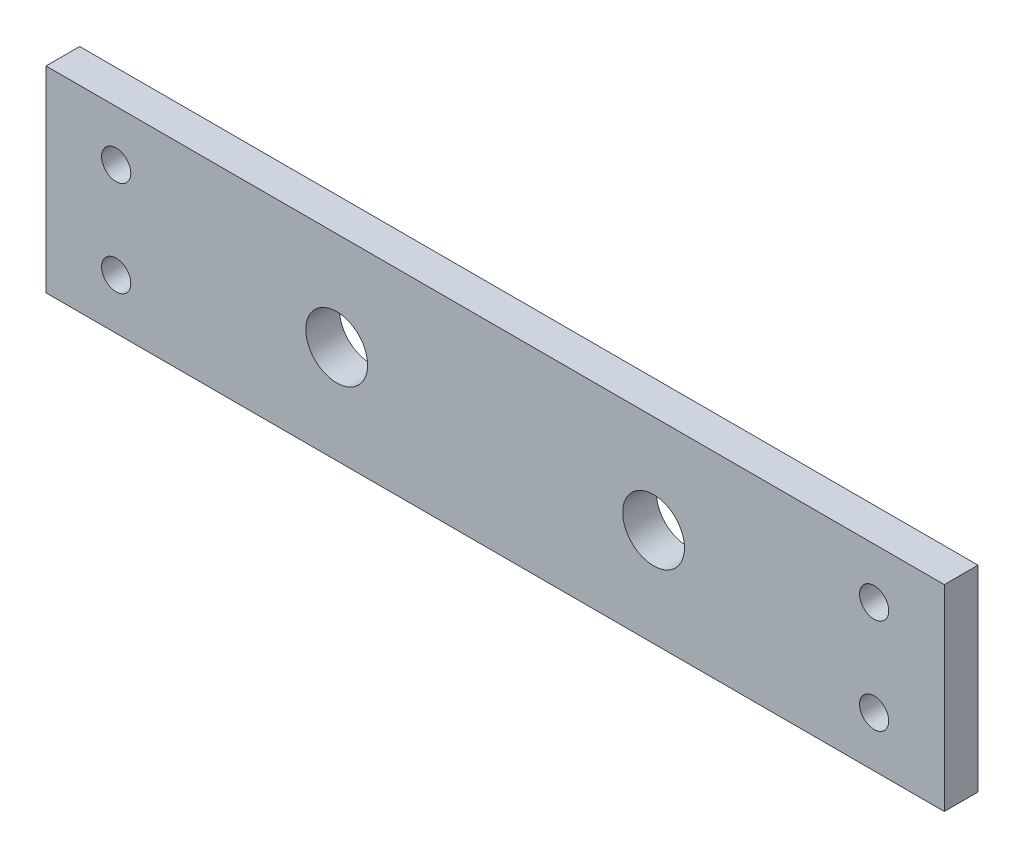
ISO-10303-21;
HEADER;
FILE_DESCRIPTION(('STEP AP214'),'2;1');
FILE_NAME('part.step','',(''),(''),'','','');
FILE_SCHEMA(('AUTOMOTIVE_DESIGN { 1 0 10303 214 1 1 1 1 }'));
ENDSEC;
DATA;
#1=APPLICATION_CONTEXT('core data for automotive mechanical design processes');
#2=APPLICATION_PROTOCOL_DEFINITION('international standard','automotive_design',2000,#1);
#3=PRODUCT_CONTEXT('',#1,'mechanical');
#4=PRODUCT('Part','Part','',(#3));
#5=PRODUCT_RELATED_PRODUCT_CATEGORY('part','',(#4));
#6=PRODUCT_DEFINITION_FORMATION('','',#4);
#7=PRODUCT_DEFINITION_CONTEXT('part definition',#1,'design');
#8=PRODUCT_DEFINITION('design','',#6,#7);
#9=PRODUCT_DEFINITION_SHAPE('','',#8);
#10=(LENGTH_UNIT() NAMED_UNIT(*) SI_UNIT(.MILLI.,.METRE.));
#11=(NAMED_UNIT(*) PLANE_ANGLE_UNIT() SI_UNIT($,.RADIAN.));
#12=(NAMED_UNIT(*) SI_UNIT($,.STERADIAN.) SOLID_ANGLE_UNIT());
#13=UNCERTAINTY_MEASURE_WITH_UNIT(LENGTH_MEASURE(1.E-05),#10,'distance_accuracy_value','');
#14=(GEOMETRIC_REPRESENTATION_CONTEXT(3) GLOBAL_UNCERTAINTY_ASSIGNED_CONTEXT((#13)) GLOBAL_UNIT_ASSIGNED_CONTEXT((#10,
#11,#12)) REPRESENTATION_CONTEXT('',''));
#15=CARTESIAN_POINT('',(0.,0.,0.));
#16=DIRECTION('',(0.,0.,1.));
#17=DIRECTION('',(1.,0.,0.));
#18=AXIS2_PLACEMENT_3D('',#15,#16,#17);
#19=CARTESIAN_POINT('',(80.,17.5,6.));
#20=DIRECTION('',(-1.,0.,0.));
#21=DIRECTION('',(0.,0.,1.));
#22=AXIS2_PLACEMENT_3D('',#19,#20,#21);
#23=PLANE('',#22);
#24=DIRECTION('',(0.,1.,0.));
#25=VECTOR('',#24,1.);
#26=CARTESIAN_POINT('',(80.,17.5,0.));
#27=LINE('',#26,#25);
#28=CARTESIAN_POINT('',(80.,-17.5,0.));
#29=VERTEX_POINT('',#28);
#30=CARTESIAN_POINT('',(80.,17.5,0.));
#31=VERTEX_POINT('',#30);
#32=EDGE_CURVE('E98',#29,#31,#27,.T.);
#33=ORIENTED_EDGE('',*,*,#32,.T.);
#34=DIRECTION('',(0.,0.,-1.));
#35=VECTOR('',#34,1.);
#36=CARTESIAN_POINT('',(80.,17.5,6.));
#37=LINE('',#36,#35);
#38=CARTESIAN_POINT('',(80.,17.5,6.));
#39=VERTEX_POINT('',#38);
#40=EDGE_CURVE('E11',#39,#31,#37,.T.);
#41=ORIENTED_EDGE('',*,*,#40,.F.);
#42=DIRECTION('',(0.,1.,0.));
#43=VECTOR('',#42,1.);
#44=CARTESIAN_POINT('',(80.,17.5,6.));
#45=LINE('',#44,#43);
#46=CARTESIAN_POINT('',(80.,-17.5,6.));
#47=VERTEX_POINT('',#46);
#48=EDGE_CURVE('E86',#47,#39,#45,.T.);
#49=ORIENTED_EDGE('',*,*,#48,.F.);
#50=DIRECTION('',(0.,0.,-1.));
#51=VECTOR('',#50,1.);
#52=CARTESIAN_POINT('',(80.,-17.5,6.));
#53=LINE('',#52,#51);
#54=EDGE_CURVE('E94',#47,#29,#53,.T.);
#55=ORIENTED_EDGE('',*,*,#54,.T.);
#56=EDGE_LOOP('',(#33,#41,#49,#55));
#57=FACE_BOUND('',#56,.T.);
#58=ADVANCED_FACE('F35',(#57),#23,.F.);
#59=CARTESIAN_POINT('',(-80.,17.5,6.));
#60=DIRECTION('',(0.,-1.,0.));
#61=DIRECTION('',(0.,0.,-1.));
#62=AXIS2_PLACEMENT_3D('',#59,#60,#61);
#63=PLANE('',#62);
#64=DIRECTION('',(-1.,0.,0.));
#65=VECTOR('',#64,1.);
#66=CARTESIAN_POINT('',(-80.,17.5,0.));
#67=LINE('',#66,#65);
#68=CARTESIAN_POINT('',(-80.,17.5,0.));
#69=VERTEX_POINT('',#68);
#70=EDGE_CURVE('E90',#31,#69,#67,.T.);
#71=ORIENTED_EDGE('',*,*,#70,.T.);
#72=DIRECTION('',(0.,0.,-1.));
#73=VECTOR('',#72,1.);
#74=CARTESIAN_POINT('',(-80.,17.5,6.));
#75=LINE('',#74,#73);
#76=CARTESIAN_POINT('',(-80.,17.5,6.));
#77=VERTEX_POINT('',#76);
#78=EDGE_CURVE('E43',#77,#69,#75,.T.);
#79=ORIENTED_EDGE('',*,*,#78,.F.);
#80=DIRECTION('',(-1.,0.,0.));
#81=VECTOR('',#80,1.);
#82=CARTESIAN_POINT('',(-80.,17.5,6.));
#83=LINE('',#82,#81);
#84=EDGE_CURVE('E81',#39,#77,#83,.T.);
#85=ORIENTED_EDGE('',*,*,#84,.F.);
#86=ORIENTED_EDGE('',*,*,#40,.T.);
#87=EDGE_LOOP('',(#71,#79,#85,#86));
#88=FACE_BOUND('',#87,.T.);
#89=ADVANCED_FACE('F89',(#88),#63,.F.);
#90=CARTESIAN_POINT('',(-80.,17.5,6.));
#91=DIRECTION('',(1.,0.,0.));
#92=DIRECTION('',(0.,0.,-1.));
#93=AXIS2_PLACEMENT_3D('',#90,#91,#92);
#94=PLANE('',#93);
#95=DIRECTION('',(0.,-1.,0.));
#96=VECTOR('',#95,1.);
#97=CARTESIAN_POINT('',(-80.,17.5,0.));
#98=LINE('',#97,#96);
#99=CARTESIAN_POINT('',(-80.,-17.5,0.));
#100=VERTEX_POINT('',#99);
#101=EDGE_CURVE('E68',#69,#100,#98,.T.);
#102=ORIENTED_EDGE('',*,*,#101,.T.);
#103=DIRECTION('',(0.,0.,-1.));
#104=VECTOR('',#103,1.);
#105=CARTESIAN_POINT('',(-80.,-17.5,6.));
#106=LINE('',#105,#104);
#107=CARTESIAN_POINT('',(-80.,-17.5,6.));
#108=VERTEX_POINT('',#107);
#109=EDGE_CURVE('E91',#108,#100,#106,.T.);
#110=ORIENTED_EDGE('',*,*,#109,.F.);
#111=DIRECTION('',(0.,-1.,0.));
#112=VECTOR('',#111,1.);
#113=CARTESIAN_POINT('',(-80.,17.5,6.));
#114=LINE('',#113,#112);
#115=EDGE_CURVE('E84',#77,#108,#114,.T.);
#116=ORIENTED_EDGE('',*,*,#115,.F.);
#117=ORIENTED_EDGE('',*,*,#78,.T.);
#118=EDGE_LOOP('',(#102,#110,#116,#117));
#119=FACE_BOUND('',#118,.T.);
#120=ADVANCED_FACE('F92',(#119),#94,.F.);
#121=CARTESIAN_POINT('',(-80.,-17.5,6.));
#122=DIRECTION('',(0.,1.,0.));
#123=DIRECTION('',(0.,0.,1.));
#124=AXIS2_PLACEMENT_3D('',#121,#122,#123);
#125=PLANE('',#124);
#126=DIRECTION('',(1.,0.,0.));
#127=VECTOR('',#126,1.);
#128=CARTESIAN_POINT('',(-80.,-17.5,0.));
#129=LINE('',#128,#127);
#130=EDGE_CURVE('E74',#100,#29,#129,.T.);
#131=ORIENTED_EDGE('',*,*,#130,.T.);
#132=ORIENTED_EDGE('',*,*,#54,.F.);
#133=DIRECTION('',(1.,0.,0.));
#134=VECTOR('',#133,1.);
#135=CARTESIAN_POINT('',(-80.,-17.5,6.));
#136=LINE('',#135,#134);
#137=EDGE_CURVE('E51',#108,#47,#136,.T.);
#138=ORIENTED_EDGE('',*,*,#137,.F.);
#139=ORIENTED_EDGE('',*,*,#109,.T.);
#140=EDGE_LOOP('',(#131,#132,#138,#139));
#141=FACE_BOUND('',#140,.T.);
#142=ADVANCED_FACE('F106',(#141),#125,.F.);
#143=CARTESIAN_POINT('',(0.,0.,6.));
#144=DIRECTION('',(0.,0.,1.));
#145=DIRECTION('',(1.,0.,0.));
#146=AXIS2_PLACEMENT_3D('',#143,#144,#145);
#147=PLANE('',#146);
#148=CARTESIAN_POINT('',(28.22,0.,6.));
#149=DIRECTION('',(0.,0.,1.));
#150=DIRECTION('',(1.,0.,0.));
#151=AXIS2_PLACEMENT_3D('',#148,#149,#150);
#152=CIRCLE('',#151,5.5);
#153=CARTESIAN_POINT('',(33.72,0.,6.));
#154=VERTEX_POINT('',#153);
#155=EDGE_CURVE('E139',#154,#154,#152,.T.);
#156=ORIENTED_EDGE('',*,*,#155,.F.);
#157=EDGE_LOOP('',(#156));
#158=FACE_BOUND('',#157,.T.);
#159=CARTESIAN_POINT('',(-28.22,0.,6.));
#160=DIRECTION('',(0.,0.,1.));
#161=DIRECTION('',(-1.,0.,0.));
#162=AXIS2_PLACEMENT_3D('',#159,#160,#161);
#163=CIRCLE('',#162,5.5);
#164=CARTESIAN_POINT('',(-22.72,0.,6.));
#165=VERTEX_POINT('',#164);
#166=EDGE_CURVE('E140',#165,#165,#163,.T.);
#167=ORIENTED_EDGE('',*,*,#166,.F.);
#168=EDGE_LOOP('',(#167));
#169=FACE_BOUND('',#168,.T.);
#170=CARTESIAN_POINT('',(67.5,-8.5,6.));
#171=DIRECTION('',(0.,0.,1.));
#172=DIRECTION('',(1.,0.,0.));
#173=AXIS2_PLACEMENT_3D('',#170,#171,#172);
#174=CIRCLE('',#173,2.6);
#175=CARTESIAN_POINT('',(70.1,-8.5,6.));
#176=VERTEX_POINT('',#175);
#177=EDGE_CURVE('E121',#176,#176,#174,.T.);
#178=ORIENTED_EDGE('',*,*,#177,.F.);
#179=EDGE_LOOP('',(#178));
#180=FACE_BOUND('',#179,.T.);
#181=CARTESIAN_POINT('',(-67.5,8.5,6.));
#182=DIRECTION('',(0.,0.,1.));
#183=DIRECTION('',(1.,0.,0.));
#184=AXIS2_PLACEMENT_3D('',#181,#182,#183);
#185=CIRCLE('',#184,2.6);
#186=CARTESIAN_POINT('',(-64.9,8.5,6.));
#187=VERTEX_POINT('',#186);
#188=EDGE_CURVE('E122',#187,#187,#185,.T.);
#189=ORIENTED_EDGE('',*,*,#188,.F.);
#190=EDGE_LOOP('',(#189));
#191=FACE_BOUND('',#190,.T.);
#192=CARTESIAN_POINT('',(-67.5,-8.5,6.));
#193=DIRECTION('',(0.,0.,1.));
#194=DIRECTION('',(1.,0.,0.));
#195=AXIS2_PLACEMENT_3D('',#192,#193,#194);
#196=CIRCLE('',#195,2.6);
#197=CARTESIAN_POINT('',(-64.9,-8.5,6.));
#198=VERTEX_POINT('',#197);
#199=EDGE_CURVE('E132',#198,#198,#196,.T.);
#200=ORIENTED_EDGE('',*,*,#199,.F.);
#201=EDGE_LOOP('',(#200));
#202=FACE_BOUND('',#201,.T.);
#203=CARTESIAN_POINT('',(67.5,8.5,6.));
#204=DIRECTION('',(0.,0.,1.));
#205=DIRECTION('',(1.,0.,0.));
#206=AXIS2_PLACEMENT_3D('',#203,#204,#205);
#207=CIRCLE('',#206,2.6);
#208=CARTESIAN_POINT('',(70.1,8.5,6.));
#209=VERTEX_POINT('',#208);
#210=EDGE_CURVE('E114',#209,#209,#207,.T.);
#211=ORIENTED_EDGE('',*,*,#210,.F.);
#212=EDGE_LOOP('',(#211));
#213=FACE_BOUND('',#212,.T.);
#214=ORIENTED_EDGE('',*,*,#48,.T.);
#215=ORIENTED_EDGE('',*,*,#84,.T.);
#216=ORIENTED_EDGE('',*,*,#115,.T.);
#217=ORIENTED_EDGE('',*,*,#137,.T.);
#218=EDGE_LOOP('',(#214,#215,#216,#217));
#219=FACE_BOUND('',#218,.T.);
#220=ADVANCED_FACE('F82',(#158,#169,#180,#191,#202,#213,#219),#147,.T.);
#221=CARTESIAN_POINT('',(0.,0.,0.));
#222=DIRECTION('',(0.,0.,1.));
#223=DIRECTION('',(1.,0.,0.));
#224=AXIS2_PLACEMENT_3D('',#221,#222,#223);
#225=PLANE('',#224);
#226=CARTESIAN_POINT('',(28.22,0.,0.));
#227=DIRECTION('',(0.,0.,1.));
#228=DIRECTION('',(1.,0.,0.));
#229=AXIS2_PLACEMENT_3D('',#226,#227,#228);
#230=CIRCLE('',#229,5.5);
#231=CARTESIAN_POINT('',(33.72,0.,0.));
#232=VERTEX_POINT('',#231);
#233=EDGE_CURVE('E135',#232,#232,#230,.F.);
#234=ORIENTED_EDGE('',*,*,#233,.F.);
#235=EDGE_LOOP('',(#234));
#236=FACE_BOUND('',#235,.T.);
#237=CARTESIAN_POINT('',(-28.22,0.,0.));
#238=DIRECTION('',(0.,0.,1.));
#239=DIRECTION('',(1.,0.,0.));
#240=AXIS2_PLACEMENT_3D('',#237,#238,#239);
#241=CIRCLE('',#240,5.5);
#242=CARTESIAN_POINT('',(-22.72,0.,0.));
#243=VERTEX_POINT('',#242);
#244=EDGE_CURVE('E136',#243,#243,#241,.F.);
#245=ORIENTED_EDGE('',*,*,#244,.F.);
#246=EDGE_LOOP('',(#245));
#247=FACE_BOUND('',#246,.T.);
#248=CARTESIAN_POINT('',(67.5,-8.5,0.));
#249=DIRECTION('',(0.,0.,1.));
#250=DIRECTION('',(1.,0.,0.));
#251=AXIS2_PLACEMENT_3D('',#248,#249,#250);
#252=CIRCLE('',#251,2.6);
#253=CARTESIAN_POINT('',(70.1,-8.5,0.));
#254=VERTEX_POINT('',#253);
#255=EDGE_CURVE('E117',#254,#254,#252,.F.);
#256=ORIENTED_EDGE('',*,*,#255,.F.);
#257=EDGE_LOOP('',(#256));
#258=FACE_BOUND('',#257,.T.);
#259=CARTESIAN_POINT('',(-67.5,8.5,0.));
#260=DIRECTION('',(0.,0.,1.));
#261=DIRECTION('',(1.,0.,0.));
#262=AXIS2_PLACEMENT_3D('',#259,#260,#261);
#263=CIRCLE('',#262,2.6);
#264=CARTESIAN_POINT('',(-64.9,8.5,0.));
#265=VERTEX_POINT('',#264);
#266=EDGE_CURVE('E118',#265,#265,#263,.F.);
#267=ORIENTED_EDGE('',*,*,#266,.F.);
#268=EDGE_LOOP('',(#267));
#269=FACE_BOUND('',#268,.T.);
#270=CARTESIAN_POINT('',(-67.5,-8.5,0.));
#271=DIRECTION('',(0.,0.,1.));
#272=DIRECTION('',(1.,0.,0.));
#273=AXIS2_PLACEMENT_3D('',#270,#271,#272);
#274=CIRCLE('',#273,2.6);
#275=CARTESIAN_POINT('',(-64.9,-8.5,0.));
#276=VERTEX_POINT('',#275);
#277=EDGE_CURVE('E125',#276,#276,#274,.F.);
#278=ORIENTED_EDGE('',*,*,#277,.F.);
#279=EDGE_LOOP('',(#278));
#280=FACE_BOUND('',#279,.T.);
#281=CARTESIAN_POINT('',(67.5,8.5,0.));
#282=DIRECTION('',(0.,0.,1.));
#283=DIRECTION('',(1.,0.,0.));
#284=AXIS2_PLACEMENT_3D('',#281,#282,#283);
#285=CIRCLE('',#284,2.6);
#286=CARTESIAN_POINT('',(70.1,8.5,0.));
#287=VERTEX_POINT('',#286);
#288=EDGE_CURVE('E101',#287,#287,#285,.F.);
#289=ORIENTED_EDGE('',*,*,#288,.F.);
#290=EDGE_LOOP('',(#289));
#291=FACE_BOUND('',#290,.T.);
#292=ORIENTED_EDGE('',*,*,#32,.F.);
#293=ORIENTED_EDGE('',*,*,#130,.F.);
#294=ORIENTED_EDGE('',*,*,#101,.F.);
#295=ORIENTED_EDGE('',*,*,#70,.F.);
#296=EDGE_LOOP('',(#292,#293,#294,#295));
#297=FACE_BOUND('',#296,.T.);
#298=ADVANCED_FACE('F109',(#236,#247,#258,#269,#280,#291,#297),#225,.F.);
#299=CARTESIAN_POINT('',(67.5,8.5,-0.00100000000000013));
#300=DIRECTION('',(0.,0.,1.));
#301=DIRECTION('',(1.,0.,0.));
#302=AXIS2_PLACEMENT_3D('',#299,#300,#301);
#303=CYLINDRICAL_SURFACE('',#302,2.6);
#304=CARTESIAN_POINT('',(70.1,8.5,6.));
#305=CARTESIAN_POINT('',(70.1,8.5,5.9375));
#306=CARTESIAN_POINT('',(70.1,8.5,5.875));
#307=CARTESIAN_POINT('',(70.1,8.5,5.75));
#308=CARTESIAN_POINT('',(70.1,8.5,5.6875));
#309=CARTESIAN_POINT('',(70.1,8.5,5.5625));
#310=CARTESIAN_POINT('',(70.1,8.5,5.5));
#311=CARTESIAN_POINT('',(70.1,8.5,5.375));
#312=CARTESIAN_POINT('',(70.1,8.5,5.3125));
#313=CARTESIAN_POINT('',(70.1,8.5,5.1875));
#314=CARTESIAN_POINT('',(70.1,8.5,5.125));
#315=CARTESIAN_POINT('',(70.1,8.5,5.));
#316=CARTESIAN_POINT('',(70.1,8.5,4.9375));
#317=CARTESIAN_POINT('',(70.1,8.5,4.8125));
#318=CARTESIAN_POINT('',(70.1,8.5,4.75));
#319=CARTESIAN_POINT('',(70.1,8.5,4.625));
#320=CARTESIAN_POINT('',(70.1,8.5,4.5625));
#321=CARTESIAN_POINT('',(70.1,8.5,4.4375));
#322=CARTESIAN_POINT('',(70.1,8.5,4.375));
#323=CARTESIAN_POINT('',(70.1,8.5,4.25));
#324=CARTESIAN_POINT('',(70.1,8.5,4.1875));
#325=CARTESIAN_POINT('',(70.1,8.5,4.0625));
#326=CARTESIAN_POINT('',(70.1,8.5,4.));
#327=CARTESIAN_POINT('',(70.1,8.5,3.875));
#328=CARTESIAN_POINT('',(70.1,8.5,3.8125));
#329=CARTESIAN_POINT('',(70.1,8.5,3.6875));
#330=CARTESIAN_POINT('',(70.1,8.5,3.625));
#331=CARTESIAN_POINT('',(70.1,8.5,3.5));
#332=CARTESIAN_POINT('',(70.1,8.5,3.4375));
#333=CARTESIAN_POINT('',(70.1,8.5,3.3125));
#334=CARTESIAN_POINT('',(70.1,8.5,3.25));
#335=CARTESIAN_POINT('',(70.1,8.5,3.125));
#336=CARTESIAN_POINT('',(70.1,8.5,3.0625));
#337=CARTESIAN_POINT('',(70.1,8.5,2.9375));
#338=CARTESIAN_POINT('',(70.1,8.5,2.875));
#339=CARTESIAN_POINT('',(70.1,8.5,2.75));
#340=CARTESIAN_POINT('',(70.1,8.5,2.6875));
#341=CARTESIAN_POINT('',(70.1,8.5,2.5625));
#342=CARTESIAN_POINT('',(70.1,8.5,2.5));
#343=CARTESIAN_POINT('',(70.1,8.5,2.375));
#344=CARTESIAN_POINT('',(70.1,8.5,2.3125));
#345=CARTESIAN_POINT('',(70.1,8.5,2.1875));
#346=CARTESIAN_POINT('',(70.1,8.5,2.125));
#347=CARTESIAN_POINT('',(70.1,8.5,2.));
#348=CARTESIAN_POINT('',(70.1,8.5,1.9375));
#349=CARTESIAN_POINT('',(70.1,8.5,1.8125));
#350=CARTESIAN_POINT('',(70.1,8.5,1.75));
#351=CARTESIAN_POINT('',(70.1,8.5,1.625));
#352=CARTESIAN_POINT('',(70.1,8.5,1.5625));
#353=CARTESIAN_POINT('',(70.1,8.5,1.4375));
#354=CARTESIAN_POINT('',(70.1,8.5,1.375));
#355=CARTESIAN_POINT('',(70.1,8.5,1.25));
#356=CARTESIAN_POINT('',(70.1,8.5,1.1875));
#357=CARTESIAN_POINT('',(70.1,8.5,1.0625));
#358=CARTESIAN_POINT('',(70.1,8.5,1.));
#359=CARTESIAN_POINT('',(70.1,8.5,0.875));
#360=CARTESIAN_POINT('',(70.1,8.5,0.8125));
#361=CARTESIAN_POINT('',(70.1,8.5,0.6875));
#362=CARTESIAN_POINT('',(70.1,8.5,0.625));
#363=CARTESIAN_POINT('',(70.1,8.5,0.5));
#364=CARTESIAN_POINT('',(70.1,8.5,0.4375));
#365=CARTESIAN_POINT('',(70.1,8.5,0.3125));
#366=CARTESIAN_POINT('',(70.1,8.5,0.25));
#367=CARTESIAN_POINT('',(70.1,8.5,0.125));
#368=CARTESIAN_POINT('',(70.1,8.5,0.0625000000000001));
#369=CARTESIAN_POINT('',(70.1,8.5,0.));
#370=B_SPLINE_CURVE_WITH_KNOTS('',3,(#304,#305,#306,#307,#308,#309,#310,#311,#312,#313,#314,
#315,#316,#317,#318,#319,#320,#321,#322,#323,#324,#325,#326,#327,#328,#329,#330,#331,#332,#333,
#334,#335,#336,#337,#338,#339,#340,#341,#342,#343,#344,#345,#346,#347,#348,#349,#350,#351,#352,
#353,#354,#355,#356,#357,#358,#359,#360,#361,#362,#363,#364,#365,#366,#367,#368,#369),
.UNSPECIFIED.,.F.,.F.,(4,2,2,2,2,2,2,2,2,2,2,2,2,2,2,2,2,2,2,2,2,2,2,2,2,2,2,2,2,2,2,2,4),(0.,
0.1875,0.375,0.5625,0.75,0.9375,1.125,1.3125,1.5,1.6875,1.875,2.0625,2.25,2.4375,2.625,2.8125,
3.,3.1875,3.375,3.5625,3.75,3.9375,4.125,4.3125,4.5,4.6875,4.875,5.0625,5.25,5.4375,5.625,
5.8125,6.),.UNSPECIFIED.);
#371=EDGE_CURVE('BSEAM164',#209,#287,#370,.T.);
#372=ORIENTED_EDGE('',*,*,#210,.T.);
#373=ORIENTED_EDGE('',*,*,#288,.T.);
#374=ORIENTED_EDGE('',*,*,#371,.T.);
#375=ORIENTED_EDGE('',*,*,#371,.F.);
#376=EDGE_LOOP('',(#372,#374,#373,#375));
#377=FACE_BOUND('',#376,.T.);
#378=ADVANCED_FACE('F164',(#377),#303,.F.);
#379=CARTESIAN_POINT('',(-67.5,-8.5,-0.00100000000000013));
#380=DIRECTION('',(0.,0.,1.));
#381=DIRECTION('',(1.,0.,0.));
#382=AXIS2_PLACEMENT_3D('',#379,#380,#381);
#383=CYLINDRICAL_SURFACE('',#382,2.6);
#384=CARTESIAN_POINT('',(-64.9,-8.5,6.));
#385=CARTESIAN_POINT('',(-64.9,-8.5,5.9375));
#386=CARTESIAN_POINT('',(-64.9,-8.5,5.875));
#387=CARTESIAN_POINT('',(-64.9,-8.5,5.75));
#388=CARTESIAN_POINT('',(-64.9,-8.5,5.6875));
#389=CARTESIAN_POINT('',(-64.9,-8.5,5.5625));
#390=CARTESIAN_POINT('',(-64.9,-8.5,5.5));
#391=CARTESIAN_POINT('',(-64.9,-8.5,5.375));
#392=CARTESIAN_POINT('',(-64.9,-8.5,5.3125));
#393=CARTESIAN_POINT('',(-64.9,-8.5,5.1875));
#394=CARTESIAN_POINT('',(-64.9,-8.5,5.125));
#395=CARTESIAN_POINT('',(-64.9,-8.5,5.));
#396=CARTESIAN_POINT('',(-64.9,-8.5,4.9375));
#397=CARTESIAN_POINT('',(-64.9,-8.5,4.8125));
#398=CARTESIAN_POINT('',(-64.9,-8.5,4.75));
#399=CARTESIAN_POINT('',(-64.9,-8.5,4.625));
#400=CARTESIAN_POINT('',(-64.9,-8.5,4.5625));
#401=CARTESIAN_POINT('',(-64.9,-8.5,4.4375));
#402=CARTESIAN_POINT('',(-64.9,-8.5,4.375));
#403=CARTESIAN_POINT('',(-64.9,-8.5,4.25));
#404=CARTESIAN_POINT('',(-64.9,-8.5,4.1875));
#405=CARTESIAN_POINT('',(-64.9,-8.5,4.0625));
#406=CARTESIAN_POINT('',(-64.9,-8.5,4.));
#407=CARTESIAN_POINT('',(-64.9,-8.5,3.875));
#408=CARTESIAN_POINT('',(-64.9,-8.5,3.8125));
#409=CARTESIAN_POINT('',(-64.9,-8.5,3.6875));
#410=CARTESIAN_POINT('',(-64.9,-8.5,3.625));
#411=CARTESIAN_POINT('',(-64.9,-8.5,3.5));
#412=CARTESIAN_POINT('',(-64.9,-8.5,3.4375));
#413=CARTESIAN_POINT('',(-64.9,-8.5,3.3125));
#414=CARTESIAN_POINT('',(-64.9,-8.5,3.25));
#415=CARTESIAN_POINT('',(-64.9,-8.5,3.125));
#416=CARTESIAN_POINT('',(-64.9,-8.5,3.0625));
#417=CARTESIAN_POINT('',(-64.9,-8.5,2.9375));
#418=CARTESIAN_POINT('',(-64.9,-8.5,2.875));
#419=CARTESIAN_POINT('',(-64.9,-8.5,2.75));
#420=CARTESIAN_POINT('',(-64.9,-8.5,2.6875));
#421=CARTESIAN_POINT('',(-64.9,-8.5,2.5625));
#422=CARTESIAN_POINT('',(-64.9,-8.5,2.5));
#423=CARTESIAN_POINT('',(-64.9,-8.5,2.375));
#424=CARTESIAN_POINT('',(-64.9,-8.5,2.3125));
#425=CARTESIAN_POINT('',(-64.9,-8.5,2.1875));
#426=CARTESIAN_POINT('',(-64.9,-8.5,2.125));
#427=CARTESIAN_POINT('',(-64.9,-8.5,2.));
#428=CARTESIAN_POINT('',(-64.9,-8.5,1.9375));
#429=CARTESIAN_POINT('',(-64.9,-8.5,1.8125));
#430=CARTESIAN_POINT('',(-64.9,-8.5,1.75));
#431=CARTESIAN_POINT('',(-64.9,-8.5,1.625));
#432=CARTESIAN_POINT('',(-64.9,-8.5,1.5625));
#433=CARTESIAN_POINT('',(-64.9,-8.5,1.4375));
#434=CARTESIAN_POINT('',(-64.9,-8.5,1.375));
#435=CARTESIAN_POINT('',(-64.9,-8.5,1.25));
#436=CARTESIAN_POINT('',(-64.9,-8.5,1.1875));
#437=CARTESIAN_POINT('',(-64.9,-8.5,1.0625));
#438=CARTESIAN_POINT('',(-64.9,-8.5,1.));
#439=CARTESIAN_POINT('',(-64.9,-8.5,0.875));
#440=CARTESIAN_POINT('',(-64.9,-8.5,0.8125));
#441=CARTESIAN_POINT('',(-64.9,-8.5,0.6875));
#442=CARTESIAN_POINT('',(-64.9,-8.5,0.625));
#443=CARTESIAN_POINT('',(-64.9,-8.5,0.5));
#444=CARTESIAN_POINT('',(-64.9,-8.5,0.4375));
#445=CARTESIAN_POINT('',(-64.9,-8.5,0.3125));
#446=CARTESIAN_POINT('',(-64.9,-8.5,0.25));
#447=CARTESIAN_POINT('',(-64.9,-8.5,0.125));
#448=CARTESIAN_POINT('',(-64.9,-8.5,0.0625000000000001));
#449=CARTESIAN_POINT('',(-64.9,-8.5,0.));
#450=B_SPLINE_CURVE_WITH_KNOTS('',3,(#384,#385,#386,#387,#388,#389,#390,#391,#392,#393,#394,
#395,#396,#397,#398,#399,#400,#401,#402,#403,#404,#405,#406,#407,#408,#409,#410,#411,#412,#413,
#414,#415,#416,#417,#418,#419,#420,#421,#422,#423,#424,#425,#426,#427,#428,#429,#430,#431,#432,
#433,#434,#435,#436,#437,#438,#439,#440,#441,#442,#443,#444,#445,#446,#447,#448,#449),
.UNSPECIFIED.,.F.,.F.,(4,2,2,2,2,2,2,2,2,2,2,2,2,2,2,2,2,2,2,2,2,2,2,2,2,2,2,2,2,2,2,2,4),(0.,
0.1875,0.375,0.5625,0.75,0.9375,1.125,1.3125,1.5,1.6875,1.875,2.0625,2.25,2.4375,2.625,2.8125,
3.,3.1875,3.375,3.5625,3.75,3.9375,4.125,4.3125,4.5,4.6875,4.875,5.0625,5.25,5.4375,5.625,
5.8125,6.),.UNSPECIFIED.);
#451=EDGE_CURVE('BSEAM167',#198,#276,#450,.T.);
#452=ORIENTED_EDGE('',*,*,#199,.T.);
#453=ORIENTED_EDGE('',*,*,#277,.T.);
#454=ORIENTED_EDGE('',*,*,#451,.T.);
#455=ORIENTED_EDGE('',*,*,#451,.F.);
#456=EDGE_LOOP('',(#452,#454,#453,#455));
#457=FACE_BOUND('',#456,.T.);
#458=ADVANCED_FACE('F167',(#457),#383,.F.);
#459=CARTESIAN_POINT('',(-67.5,8.5,-0.00100000000000013));
#460=DIRECTION('',(0.,0.,1.));
#461=DIRECTION('',(1.,0.,0.));
#462=AXIS2_PLACEMENT_3D('',#459,#460,#461);
#463=CYLINDRICAL_SURFACE('',#462,2.6);
#464=CARTESIAN_POINT('',(-64.9,8.5,6.));
#465=CARTESIAN_POINT('',(-64.9,8.5,5.9375));
#466=CARTESIAN_POINT('',(-64.9,8.5,5.875));
#467=CARTESIAN_POINT('',(-64.9,8.5,5.75));
#468=CARTESIAN_POINT('',(-64.9,8.5,5.6875));
#469=CARTESIAN_POINT('',(-64.9,8.5,5.5625));
#470=CARTESIAN_POINT('',(-64.9,8.5,5.5));
#471=CARTESIAN_POINT('',(-64.9,8.5,5.375));
#472=CARTESIAN_POINT('',(-64.9,8.5,5.3125));
#473=CARTESIAN_POINT('',(-64.9,8.5,5.1875));
#474=CARTESIAN_POINT('',(-64.9,8.5,5.125));
#475=CARTESIAN_POINT('',(-64.9,8.5,5.));
#476=CARTESIAN_POINT('',(-64.9,8.5,4.9375));
#477=CARTESIAN_POINT('',(-64.9,8.5,4.8125));
#478=CARTESIAN_POINT('',(-64.9,8.5,4.75));
#479=CARTESIAN_POINT('',(-64.9,8.5,4.625));
#480=CARTESIAN_POINT('',(-64.9,8.5,4.5625));
#481=CARTESIAN_POINT('',(-64.9,8.5,4.4375));
#482=CARTESIAN_POINT('',(-64.9,8.5,4.375));
#483=CARTESIAN_POINT('',(-64.9,8.5,4.25));
#484=CARTESIAN_POINT('',(-64.9,8.5,4.1875));
#485=CARTESIAN_POINT('',(-64.9,8.5,4.0625));
#486=CARTESIAN_POINT('',(-64.9,8.5,4.));
#487=CARTESIAN_POINT('',(-64.9,8.5,3.875));
#488=CARTESIAN_POINT('',(-64.9,8.5,3.8125));
#489=CARTESIAN_POINT('',(-64.9,8.5,3.6875));
#490=CARTESIAN_POINT('',(-64.9,8.5,3.625));
#491=CARTESIAN_POINT('',(-64.9,8.5,3.5));
#492=CARTESIAN_POINT('',(-64.9,8.5,3.4375));
#493=CARTESIAN_POINT('',(-64.9,8.5,3.3125));
#494=CARTESIAN_POINT('',(-64.9,8.5,3.25));
#495=CARTESIAN_POINT('',(-64.9,8.5,3.125));
#496=CARTESIAN_POINT('',(-64.9,8.5,3.0625));
#497=CARTESIAN_POINT('',(-64.9,8.5,2.9375));
#498=CARTESIAN_POINT('',(-64.9,8.5,2.875));
#499=CARTESIAN_POINT('',(-64.9,8.5,2.75));
#500=CARTESIAN_POINT('',(-64.9,8.5,2.6875));
#501=CARTESIAN_POINT('',(-64.9,8.5,2.5625));
#502=CARTESIAN_POINT('',(-64.9,8.5,2.5));
#503=CARTESIAN_POINT('',(-64.9,8.5,2.375));
#504=CARTESIAN_POINT('',(-64.9,8.5,2.3125));
#505=CARTESIAN_POINT('',(-64.9,8.5,2.1875));
#506=CARTESIAN_POINT('',(-64.9,8.5,2.125));
#507=CARTESIAN_POINT('',(-64.9,8.5,2.));
#508=CARTESIAN_POINT('',(-64.9,8.5,1.9375));
#509=CARTESIAN_POINT('',(-64.9,8.5,1.8125));
#510=CARTESIAN_POINT('',(-64.9,8.5,1.75));
#511=CARTESIAN_POINT('',(-64.9,8.5,1.625));
#512=CARTESIAN_POINT('',(-64.9,8.5,1.5625));
#513=CARTESIAN_POINT('',(-64.9,8.5,1.4375));
#514=CARTESIAN_POINT('',(-64.9,8.5,1.375));
#515=CARTESIAN_POINT('',(-64.9,8.5,1.25));
#516=CARTESIAN_POINT('',(-64.9,8.5,1.1875));
#517=CARTESIAN_POINT('',(-64.9,8.5,1.0625));
#518=CARTESIAN_POINT('',(-64.9,8.5,1.));
#519=CARTESIAN_POINT('',(-64.9,8.5,0.875));
#520=CARTESIAN_POINT('',(-64.9,8.5,0.8125));
#521=CARTESIAN_POINT('',(-64.9,8.5,0.6875));
#522=CARTESIAN_POINT('',(-64.9,8.5,0.625));
#523=CARTESIAN_POINT('',(-64.9,8.5,0.5));
#524=CARTESIAN_POINT('',(-64.9,8.5,0.4375));
#525=CARTESIAN_POINT('',(-64.9,8.5,0.3125));
#526=CARTESIAN_POINT('',(-64.9,8.5,0.25));
#527=CARTESIAN_POINT('',(-64.9,8.5,0.125));
#528=CARTESIAN_POINT('',(-64.9,8.5,0.0625000000000001));
#529=CARTESIAN_POINT('',(-64.9,8.5,0.));
#530=B_SPLINE_CURVE_WITH_KNOTS('',3,(#464,#465,#466,#467,#468,#469,#470,#471,#472,#473,#474,
#475,#476,#477,#478,#479,#480,#481,#482,#483,#484,#485,#486,#487,#488,#489,#490,#491,#492,#493,
#494,#495,#496,#497,#498,#499,#500,#501,#502,#503,#504,#505,#506,#507,#508,#509,#510,#511,#512,
#513,#514,#515,#516,#517,#518,#519,#520,#521,#522,#523,#524,#525,#526,#527,#528,#529),
.UNSPECIFIED.,.F.,.F.,(4,2,2,2,2,2,2,2,2,2,2,2,2,2,2,2,2,2,2,2,2,2,2,2,2,2,2,2,2,2,2,2,4),(0.,
0.1875,0.375,0.5625,0.75,0.9375,1.125,1.3125,1.5,1.6875,1.875,2.0625,2.25,2.4375,2.625,2.8125,
3.,3.1875,3.375,3.5625,3.75,3.9375,4.125,4.3125,4.5,4.6875,4.875,5.0625,5.25,5.4375,5.625,
5.8125,6.),.UNSPECIFIED.);
#531=EDGE_CURVE('BSEAM233',#187,#265,#530,.T.);
#532=ORIENTED_EDGE('',*,*,#188,.T.);
#533=ORIENTED_EDGE('',*,*,#266,.T.);
#534=ORIENTED_EDGE('',*,*,#531,.T.);
#535=ORIENTED_EDGE('',*,*,#531,.F.);
#536=EDGE_LOOP('',(#532,#534,#533,#535));
#537=FACE_BOUND('',#536,.T.);
#538=ADVANCED_FACE('F233',(#537),#463,.F.);
#539=CARTESIAN_POINT('',(67.5,-8.5,-0.00100000000000013));
#540=DIRECTION('',(0.,0.,1.));
#541=DIRECTION('',(1.,0.,0.));
#542=AXIS2_PLACEMENT_3D('',#539,#540,#541);
#543=CYLINDRICAL_SURFACE('',#542,2.6);
#544=CARTESIAN_POINT('',(70.1,-8.5,6.));
#545=CARTESIAN_POINT('',(70.1,-8.5,5.9375));
#546=CARTESIAN_POINT('',(70.1,-8.5,5.875));
#547=CARTESIAN_POINT('',(70.1,-8.5,5.75));
#548=CARTESIAN_POINT('',(70.1,-8.5,5.6875));
#549=CARTESIAN_POINT('',(70.1,-8.5,5.5625));
#550=CARTESIAN_POINT('',(70.1,-8.5,5.5));
#551=CARTESIAN_POINT('',(70.1,-8.5,5.375));
#552=CARTESIAN_POINT('',(70.1,-8.5,5.3125));
#553=CARTESIAN_POINT('',(70.1,-8.5,5.1875));
#554=CARTESIAN_POINT('',(70.1,-8.5,5.125));
#555=CARTESIAN_POINT('',(70.1,-8.5,5.));
#556=CARTESIAN_POINT('',(70.1,-8.5,4.9375));
#557=CARTESIAN_POINT('',(70.1,-8.5,4.8125));
#558=CARTESIAN_POINT('',(70.1,-8.5,4.75));
#559=CARTESIAN_POINT('',(70.1,-8.5,4.625));
#560=CARTESIAN_POINT('',(70.1,-8.5,4.5625));
#561=CARTESIAN_POINT('',(70.1,-8.5,4.4375));
#562=CARTESIAN_POINT('',(70.1,-8.5,4.375));
#563=CARTESIAN_POINT('',(70.1,-8.5,4.25));
#564=CARTESIAN_POINT('',(70.1,-8.5,4.1875));
#565=CARTESIAN_POINT('',(70.1,-8.5,4.0625));
#566=CARTESIAN_POINT('',(70.1,-8.5,4.));
#567=CARTESIAN_POINT('',(70.1,-8.5,3.875));
#568=CARTESIAN_POINT('',(70.1,-8.5,3.8125));
#569=CARTESIAN_POINT('',(70.1,-8.5,3.6875));
#570=CARTESIAN_POINT('',(70.1,-8.5,3.625));
#571=CARTESIAN_POINT('',(70.1,-8.5,3.5));
#572=CARTESIAN_POINT('',(70.1,-8.5,3.4375));
#573=CARTESIAN_POINT('',(70.1,-8.5,3.3125));
#574=CARTESIAN_POINT('',(70.1,-8.5,3.25));
#575=CARTESIAN_POINT('',(70.1,-8.5,3.125));
#576=CARTESIAN_POINT('',(70.1,-8.5,3.0625));
#577=CARTESIAN_POINT('',(70.1,-8.5,2.9375));
#578=CARTESIAN_POINT('',(70.1,-8.5,2.875));
#579=CARTESIAN_POINT('',(70.1,-8.5,2.75));
#580=CARTESIAN_POINT('',(70.1,-8.5,2.6875));
#581=CARTESIAN_POINT('',(70.1,-8.5,2.5625));
#582=CARTESIAN_POINT('',(70.1,-8.5,2.5));
#583=CARTESIAN_POINT('',(70.1,-8.5,2.375));
#584=CARTESIAN_POINT('',(70.1,-8.5,2.3125));
#585=CARTESIAN_POINT('',(70.1,-8.5,2.1875));
#586=CARTESIAN_POINT('',(70.1,-8.5,2.125));
#587=CARTESIAN_POINT('',(70.1,-8.5,2.));
#588=CARTESIAN_POINT('',(70.1,-8.5,1.9375));
#589=CARTESIAN_POINT('',(70.1,-8.5,1.8125));
#590=CARTESIAN_POINT('',(70.1,-8.5,1.75));
#591=CARTESIAN_POINT('',(70.1,-8.5,1.625));
#592=CARTESIAN_POINT('',(70.1,-8.5,1.5625));
#593=CARTESIAN_POINT('',(70.1,-8.5,1.4375));
#594=CARTESIAN_POINT('',(70.1,-8.5,1.375));
#595=CARTESIAN_POINT('',(70.1,-8.5,1.25));
#596=CARTESIAN_POINT('',(70.1,-8.5,1.1875));
#597=CARTESIAN_POINT('',(70.1,-8.5,1.0625));
#598=CARTESIAN_POINT('',(70.1,-8.5,1.));
#599=CARTESIAN_POINT('',(70.1,-8.5,0.875));
#600=CARTESIAN_POINT('',(70.1,-8.5,0.8125));
#601=CARTESIAN_POINT('',(70.1,-8.5,0.6875));
#602=CARTESIAN_POINT('',(70.1,-8.5,0.625));
#603=CARTESIAN_POINT('',(70.1,-8.5,0.5));
#604=CARTESIAN_POINT('',(70.1,-8.5,0.4375));
#605=CARTESIAN_POINT('',(70.1,-8.5,0.3125));
#606=CARTESIAN_POINT('',(70.1,-8.5,0.25));
#607=CARTESIAN_POINT('',(70.1,-8.5,0.125));
#608=CARTESIAN_POINT('',(70.1,-8.5,0.0625000000000001));
#609=CARTESIAN_POINT('',(70.1,-8.5,0.));
#610=B_SPLINE_CURVE_WITH_KNOTS('',3,(#544,#545,#546,#547,#548,#549,#550,#551,#552,#553,#554,
#555,#556,#557,#558,#559,#560,#561,#562,#563,#564,#565,#566,#567,#568,#569,#570,#571,#572,#573,
#574,#575,#576,#577,#578,#579,#580,#581,#582,#583,#584,#585,#586,#587,#588,#589,#590,#591,#592,
#593,#594,#595,#596,#597,#598,#599,#600,#601,#602,#603,#604,#605,#606,#607,#608,#609),
.UNSPECIFIED.,.F.,.F.,(4,2,2,2,2,2,2,2,2,2,2,2,2,2,2,2,2,2,2,2,2,2,2,2,2,2,2,2,2,2,2,2,4),(0.,
0.1875,0.375,0.5625,0.75,0.9375,1.125,1.3125,1.5,1.6875,1.875,2.0625,2.25,2.4375,2.625,2.8125,
3.,3.1875,3.375,3.5625,3.75,3.9375,4.125,4.3125,4.5,4.6875,4.875,5.0625,5.25,5.4375,5.625,
5.8125,6.),.UNSPECIFIED.);
#611=EDGE_CURVE('BSEAM203',#176,#254,#610,.T.);
#612=ORIENTED_EDGE('',*,*,#177,.T.);
#613=ORIENTED_EDGE('',*,*,#255,.T.);
#614=ORIENTED_EDGE('',*,*,#611,.T.);
#615=ORIENTED_EDGE('',*,*,#611,.F.);
#616=EDGE_LOOP('',(#612,#614,#613,#615));
#617=FACE_BOUND('',#616,.T.);
#618=ADVANCED_FACE('F203',(#617),#543,.F.);
#619=CARTESIAN_POINT('',(-28.22,0.,-0.00100000000000013));
#620=DIRECTION('',(0.,0.,1.));
#621=DIRECTION('',(1.,0.,0.));
#622=AXIS2_PLACEMENT_3D('',#619,#620,#621);
#623=CYLINDRICAL_SURFACE('',#622,5.5);
#624=CARTESIAN_POINT('',(-22.72,0.,6.));
#625=CARTESIAN_POINT('',(-22.72,0.,5.9375));
#626=CARTESIAN_POINT('',(-22.72,0.,5.875));
#627=CARTESIAN_POINT('',(-22.72,0.,5.75));
#628=CARTESIAN_POINT('',(-22.72,0.,5.6875));
#629=CARTESIAN_POINT('',(-22.72,0.,5.5625));
#630=CARTESIAN_POINT('',(-22.72,0.,5.5));
#631=CARTESIAN_POINT('',(-22.72,0.,5.375));
#632=CARTESIAN_POINT('',(-22.72,0.,5.3125));
#633=CARTESIAN_POINT('',(-22.72,0.,5.1875));
#634=CARTESIAN_POINT('',(-22.72,0.,5.125));
#635=CARTESIAN_POINT('',(-22.72,0.,5.));
#636=CARTESIAN_POINT('',(-22.72,0.,4.9375));
#637=CARTESIAN_POINT('',(-22.72,0.,4.8125));
#638=CARTESIAN_POINT('',(-22.72,0.,4.75));
#639=CARTESIAN_POINT('',(-22.72,0.,4.625));
#640=CARTESIAN_POINT('',(-22.72,0.,4.5625));
#641=CARTESIAN_POINT('',(-22.72,0.,4.4375));
#642=CARTESIAN_POINT('',(-22.72,0.,4.375));
#643=CARTESIAN_POINT('',(-22.72,0.,4.25));
#644=CARTESIAN_POINT('',(-22.72,0.,4.1875));
#645=CARTESIAN_POINT('',(-22.72,0.,4.0625));
#646=CARTESIAN_POINT('',(-22.72,0.,4.));
#647=CARTESIAN_POINT('',(-22.72,0.,3.875));
#648=CARTESIAN_POINT('',(-22.72,0.,3.8125));
#649=CARTESIAN_POINT('',(-22.72,0.,3.6875));
#650=CARTESIAN_POINT('',(-22.72,0.,3.625));
#651=CARTESIAN_POINT('',(-22.72,0.,3.5));
#652=CARTESIAN_POINT('',(-22.72,0.,3.4375));
#653=CARTESIAN_POINT('',(-22.72,0.,3.3125));
#654=CARTESIAN_POINT('',(-22.72,0.,3.25));
#655=CARTESIAN_POINT('',(-22.72,0.,3.125));
#656=CARTESIAN_POINT('',(-22.72,0.,3.0625));
#657=CARTESIAN_POINT('',(-22.72,0.,2.9375));
#658=CARTESIAN_POINT('',(-22.72,0.,2.875));
#659=CARTESIAN_POINT('',(-22.72,0.,2.75));
#660=CARTESIAN_POINT('',(-22.72,0.,2.6875));
#661=CARTESIAN_POINT('',(-22.72,0.,2.5625));
#662=CARTESIAN_POINT('',(-22.72,0.,2.5));
#663=CARTESIAN_POINT('',(-22.72,0.,2.375));
#664=CARTESIAN_POINT('',(-22.72,0.,2.3125));
#665=CARTESIAN_POINT('',(-22.72,0.,2.1875));
#666=CARTESIAN_POINT('',(-22.72,0.,2.125));
#667=CARTESIAN_POINT('',(-22.72,0.,2.));
#668=CARTESIAN_POINT('',(-22.72,0.,1.9375));
#669=CARTESIAN_POINT('',(-22.72,0.,1.8125));
#670=CARTESIAN_POINT('',(-22.72,0.,1.75));
#671=CARTESIAN_POINT('',(-22.72,0.,1.625));
#672=CARTESIAN_POINT('',(-22.72,0.,1.5625));
#673=CARTESIAN_POINT('',(-22.72,0.,1.4375));
#674=CARTESIAN_POINT('',(-22.72,0.,1.375));
#675=CARTESIAN_POINT('',(-22.72,0.,1.25));
#676=CARTESIAN_POINT('',(-22.72,0.,1.1875));
#677=CARTESIAN_POINT('',(-22.72,0.,1.0625));
#678=CARTESIAN_POINT('',(-22.72,0.,1.));
#679=CARTESIAN_POINT('',(-22.72,0.,0.875));
#680=CARTESIAN_POINT('',(-22.72,0.,0.8125));
#681=CARTESIAN_POINT('',(-22.72,0.,0.6875));
#682=CARTESIAN_POINT('',(-22.72,0.,0.625));
#683=CARTESIAN_POINT('',(-22.72,0.,0.5));
#684=CARTESIAN_POINT('',(-22.72,0.,0.4375));
#685=CARTESIAN_POINT('',(-22.72,0.,0.3125));
#686=CARTESIAN_POINT('',(-22.72,0.,0.25));
#687=CARTESIAN_POINT('',(-22.72,0.,0.125));
#688=CARTESIAN_POINT('',(-22.72,0.,0.0625000000000001));
#689=CARTESIAN_POINT('',(-22.72,0.,0.));
#690=B_SPLINE_CURVE_WITH_KNOTS('',3,(#624,#625,#626,#627,#628,#629,#630,#631,#632,#633,#634,
#635,#636,#637,#638,#639,#640,#641,#642,#643,#644,#645,#646,#647,#648,#649,#650,#651,#652,#653,
#654,#655,#656,#657,#658,#659,#660,#661,#662,#663,#664,#665,#666,#667,#668,#669,#670,#671,#672,
#673,#674,#675,#676,#677,#678,#679,#680,#681,#682,#683,#684,#685,#686,#687,#688,#689),
.UNSPECIFIED.,.F.,.F.,(4,2,2,2,2,2,2,2,2,2,2,2,2,2,2,2,2,2,2,2,2,2,2,2,2,2,2,2,2,2,2,2,4),(0.,
0.1875,0.375,0.5625,0.75,0.9375,1.125,1.3125,1.5,1.6875,1.875,2.0625,2.25,2.4375,2.625,2.8125,
3.,3.1875,3.375,3.5625,3.75,3.9375,4.125,4.3125,4.5,4.6875,4.875,5.0625,5.25,5.4375,5.625,
5.8125,6.),.UNSPECIFIED.);
#691=EDGE_CURVE('BSEAM213',#165,#243,#690,.T.);
#692=ORIENTED_EDGE('',*,*,#166,.T.);
#693=ORIENTED_EDGE('',*,*,#244,.T.);
#694=ORIENTED_EDGE('',*,*,#691,.T.);
#695=ORIENTED_EDGE('',*,*,#691,.F.);
#696=EDGE_LOOP('',(#692,#694,#693,#695));
#697=FACE_BOUND('',#696,.T.);
#698=ADVANCED_FACE('F213',(#697),#623,.F.);
#699=CARTESIAN_POINT('',(28.22,0.,-0.00100000000000013));
#700=DIRECTION('',(0.,0.,1.));
#701=DIRECTION('',(1.,0.,0.));
#702=AXIS2_PLACEMENT_3D('',#699,#700,#701);
#703=CYLINDRICAL_SURFACE('',#702,5.5);
#704=CARTESIAN_POINT('',(33.72,0.,6.));
#705=CARTESIAN_POINT('',(33.72,0.,5.9375));
#706=CARTESIAN_POINT('',(33.72,0.,5.875));
#707=CARTESIAN_POINT('',(33.72,0.,5.75));
#708=CARTESIAN_POINT('',(33.72,0.,5.6875));
#709=CARTESIAN_POINT('',(33.72,0.,5.5625));
#710=CARTESIAN_POINT('',(33.72,0.,5.5));
#711=CARTESIAN_POINT('',(33.72,0.,5.375));
#712=CARTESIAN_POINT('',(33.72,0.,5.3125));
#713=CARTESIAN_POINT('',(33.72,0.,5.1875));
#714=CARTESIAN_POINT('',(33.72,0.,5.125));
#715=CARTESIAN_POINT('',(33.72,0.,5.));
#716=CARTESIAN_POINT('',(33.72,0.,4.9375));
#717=CARTESIAN_POINT('',(33.72,0.,4.8125));
#718=CARTESIAN_POINT('',(33.72,0.,4.75));
#719=CARTESIAN_POINT('',(33.72,0.,4.625));
#720=CARTESIAN_POINT('',(33.72,0.,4.5625));
#721=CARTESIAN_POINT('',(33.72,0.,4.4375));
#722=CARTESIAN_POINT('',(33.72,0.,4.375));
#723=CARTESIAN_POINT('',(33.72,0.,4.25));
#724=CARTESIAN_POINT('',(33.72,0.,4.1875));
#725=CARTESIAN_POINT('',(33.72,0.,4.0625));
#726=CARTESIAN_POINT('',(33.72,0.,4.));
#727=CARTESIAN_POINT('',(33.72,0.,3.875));
#728=CARTESIAN_POINT('',(33.72,0.,3.8125));
#729=CARTESIAN_POINT('',(33.72,0.,3.6875));
#730=CARTESIAN_POINT('',(33.72,0.,3.625));
#731=CARTESIAN_POINT('',(33.72,0.,3.5));
#732=CARTESIAN_POINT('',(33.72,0.,3.4375));
#733=CARTESIAN_POINT('',(33.72,0.,3.3125));
#734=CARTESIAN_POINT('',(33.72,0.,3.25));
#735=CARTESIAN_POINT('',(33.72,0.,3.125));
#736=CARTESIAN_POINT('',(33.72,0.,3.0625));
#737=CARTESIAN_POINT('',(33.72,0.,2.9375));
#738=CARTESIAN_POINT('',(33.72,0.,2.875));
#739=CARTESIAN_POINT('',(33.72,0.,2.75));
#740=CARTESIAN_POINT('',(33.72,0.,2.6875));
#741=CARTESIAN_POINT('',(33.72,0.,2.5625));
#742=CARTESIAN_POINT('',(33.72,0.,2.5));
#743=CARTESIAN_POINT('',(33.72,0.,2.375));
#744=CARTESIAN_POINT('',(33.72,0.,2.3125));
#745=CARTESIAN_POINT('',(33.72,0.,2.1875));
#746=CARTESIAN_POINT('',(33.72,0.,2.125));
#747=CARTESIAN_POINT('',(33.72,0.,2.));
#748=CARTESIAN_POINT('',(33.72,0.,1.9375));
#749=CARTESIAN_POINT('',(33.72,0.,1.8125));
#750=CARTESIAN_POINT('',(33.72,0.,1.75));
#751=CARTESIAN_POINT('',(33.72,0.,1.625));
#752=CARTESIAN_POINT('',(33.72,0.,1.5625));
#753=CARTESIAN_POINT('',(33.72,0.,1.4375));
#754=CARTESIAN_POINT('',(33.72,0.,1.375));
#755=CARTESIAN_POINT('',(33.72,0.,1.25));
#756=CARTESIAN_POINT('',(33.72,0.,1.1875));
#757=CARTESIAN_POINT('',(33.72,0.,1.0625));
#758=CARTESIAN_POINT('',(33.72,0.,1.));
#759=CARTESIAN_POINT('',(33.72,0.,0.875));
#760=CARTESIAN_POINT('',(33.72,0.,0.8125));
#761=CARTESIAN_POINT('',(33.72,0.,0.6875));
#762=CARTESIAN_POINT('',(33.72,0.,0.625));
#763=CARTESIAN_POINT('',(33.72,0.,0.5));
#764=CARTESIAN_POINT('',(33.72,0.,0.4375));
#765=CARTESIAN_POINT('',(33.72,0.,0.3125));
#766=CARTESIAN_POINT('',(33.72,0.,0.25));
#767=CARTESIAN_POINT('',(33.72,0.,0.125));
#768=CARTESIAN_POINT('',(33.72,0.,0.0625000000000001));
#769=CARTESIAN_POINT('',(33.72,0.,0.));
#770=B_SPLINE_CURVE_WITH_KNOTS('',3,(#704,#705,#706,#707,#708,#709,#710,#711,#712,#713,#714,
#715,#716,#717,#718,#719,#720,#721,#722,#723,#724,#725,#726,#727,#728,#729,#730,#731,#732,#733,
#734,#735,#736,#737,#738,#739,#740,#741,#742,#743,#744,#745,#746,#747,#748,#749,#750,#751,#752,
#753,#754,#755,#756,#757,#758,#759,#760,#761,#762,#763,#764,#765,#766,#767,#768,#769),
.UNSPECIFIED.,.F.,.F.,(4,2,2,2,2,2,2,2,2,2,2,2,2,2,2,2,2,2,2,2,2,2,2,2,2,2,2,2,2,2,2,2,4),(0.,
0.1875,0.375,0.5625,0.75,0.9375,1.125,1.3125,1.5,1.6875,1.875,2.0625,2.25,2.4375,2.625,2.8125,
3.,3.1875,3.375,3.5625,3.75,3.9375,4.125,4.3125,4.5,4.6875,4.875,5.0625,5.25,5.4375,5.625,
5.8125,6.),.UNSPECIFIED.);
#771=EDGE_CURVE('BSEAM148',#154,#232,#770,.T.);
#772=ORIENTED_EDGE('',*,*,#155,.T.);
#773=ORIENTED_EDGE('',*,*,#233,.T.);
#774=ORIENTED_EDGE('',*,*,#771,.T.);
#775=ORIENTED_EDGE('',*,*,#771,.F.);
#776=EDGE_LOOP('',(#772,#774,#773,#775));
#777=FACE_BOUND('',#776,.T.);
#778=ADVANCED_FACE('F148',(#777),#703,.F.);
#779=CLOSED_SHELL('',(#58,#89,#120,#142,#220,#298,#378,#458,#538,#618,#698,#778));
#780=MANIFOLD_SOLID_BREP('B2',#779);
#781=ADVANCED_BREP_SHAPE_REPRESENTATION('',(#18,#780),#14);
#782=SHAPE_DEFINITION_REPRESENTATION(#9,#781);
ENDSEC;
END-ISO-10303-21;
